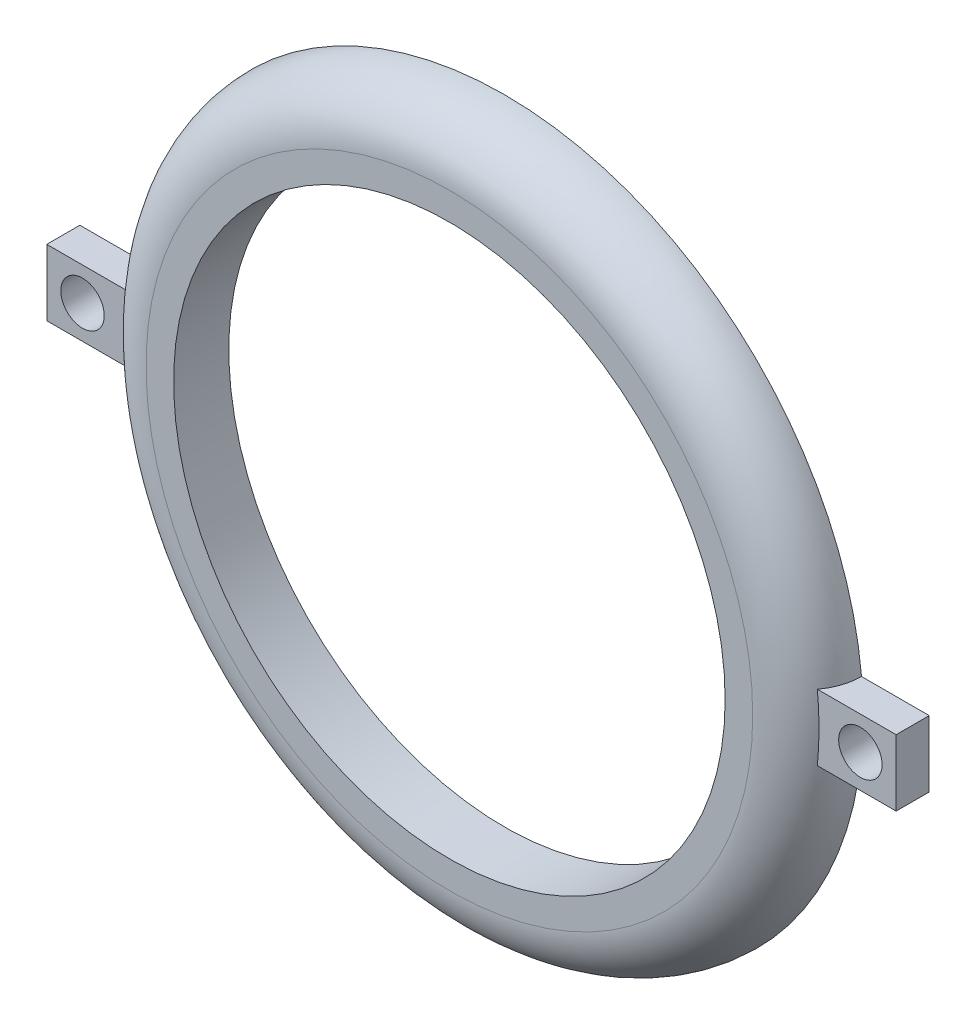
ISO-10303-21;
HEADER;
FILE_DESCRIPTION(('STEP AP214'),'2;1');
FILE_NAME('part.step','',(''),(''),'','','');
FILE_SCHEMA(('AUTOMOTIVE_DESIGN { 1 0 10303 214 1 1 1 1 }'));
ENDSEC;
DATA;
#1=APPLICATION_CONTEXT('core data for automotive mechanical design processes');
#2=APPLICATION_PROTOCOL_DEFINITION('international standard','automotive_design',2000,#1);
#3=PRODUCT_CONTEXT('',#1,'mechanical');
#4=PRODUCT('Part','Part','',(#3));
#5=PRODUCT_RELATED_PRODUCT_CATEGORY('part','',(#4));
#6=PRODUCT_DEFINITION_FORMATION('','',#4);
#7=PRODUCT_DEFINITION_CONTEXT('part definition',#1,'design');
#8=PRODUCT_DEFINITION('design','',#6,#7);
#9=PRODUCT_DEFINITION_SHAPE('','',#8);
#10=(LENGTH_UNIT() NAMED_UNIT(*) SI_UNIT(.MILLI.,.METRE.));
#11=(NAMED_UNIT(*) PLANE_ANGLE_UNIT() SI_UNIT($,.RADIAN.));
#12=(NAMED_UNIT(*) SI_UNIT($,.STERADIAN.) SOLID_ANGLE_UNIT());
#13=UNCERTAINTY_MEASURE_WITH_UNIT(LENGTH_MEASURE(1.E-05),#10,'distance_accuracy_value','');
#14=(GEOMETRIC_REPRESENTATION_CONTEXT(3) GLOBAL_UNCERTAINTY_ASSIGNED_CONTEXT((#13)) GLOBAL_UNIT_ASSIGNED_CONTEXT((#10,
#11,#12)) REPRESENTATION_CONTEXT('',''));
#15=CARTESIAN_POINT('',(0.,0.,0.));
#16=DIRECTION('',(0.,0.,1.));
#17=DIRECTION('',(1.,0.,0.));
#18=AXIS2_PLACEMENT_3D('',#15,#16,#17);
#19=CARTESIAN_POINT('',(0.,0.,2.54));
#20=DIRECTION('',(0.,0.,1.));
#21=DIRECTION('',(1.,0.,0.));
#22=AXIS2_PLACEMENT_3D('',#19,#20,#21);
#23=PLANE('',#22);
#24=CARTESIAN_POINT('',(0.,0.,2.54));
#25=DIRECTION('',(0.,0.,1.));
#26=DIRECTION('',(1.,0.,0.));
#27=AXIS2_PLACEMENT_3D('',#24,#25,#26);
#28=CIRCLE('',#27,13.97);
#29=CARTESIAN_POINT('',(13.97,0.,2.54));
#30=VERTEX_POINT('',#29);
#31=EDGE_CURVE('E121',#30,#30,#28,.T.);
#32=ORIENTED_EDGE('',*,*,#31,.T.);
#33=EDGE_LOOP('',(#32));
#34=FACE_BOUND('',#33,.T.);
#35=CARTESIAN_POINT('',(0.,0.,2.54));
#36=DIRECTION('',(0.,0.,1.));
#37=DIRECTION('',(1.,0.,0.));
#38=AXIS2_PLACEMENT_3D('',#35,#36,#37);
#39=CIRCLE('',#38,12.7);
#40=CARTESIAN_POINT('',(12.7,0.,2.54));
#41=VERTEX_POINT('',#40);
#42=EDGE_CURVE('E134',#41,#41,#39,.T.);
#43=ORIENTED_EDGE('',*,*,#42,.F.);
#44=EDGE_LOOP('',(#43));
#45=FACE_BOUND('',#44,.T.);
#46=ADVANCED_FACE('F39',(#34,#45),#23,.T.);
#47=CARTESIAN_POINT('',(0.,0.,0.));
#48=DIRECTION('',(0.,0.,1.));
#49=DIRECTION('',(1.,0.,0.));
#50=AXIS2_PLACEMENT_3D('',#47,#48,#49);
#51=PLANE('',#50);
#52=CARTESIAN_POINT('',(17.9112555409049,0.,0.));
#53=DIRECTION('',(0.,0.,1.));
#54=DIRECTION('',(1.,0.,0.));
#55=AXIS2_PLACEMENT_3D('',#52,#53,#54);
#56=CIRCLE('',#55,1.);
#57=CARTESIAN_POINT('',(18.9112555409049,0.,0.));
#58=VERTEX_POINT('',#57);
#59=EDGE_CURVE('E224',#58,#58,#56,.F.);
#60=ORIENTED_EDGE('',*,*,#59,.F.);
#61=EDGE_LOOP('',(#60));
#62=FACE_BOUND('',#61,.T.);
#63=CARTESIAN_POINT('',(-17.9112555409049,0.,0.));
#64=DIRECTION('',(0.,0.,1.));
#65=DIRECTION('',(1.,0.,0.));
#66=AXIS2_PLACEMENT_3D('',#63,#64,#65);
#67=CIRCLE('',#66,1.);
#68=CARTESIAN_POINT('',(-16.9112555409049,0.,0.));
#69=VERTEX_POINT('',#68);
#70=EDGE_CURVE('E227',#69,#69,#67,.T.);
#71=ORIENTED_EDGE('',*,*,#70,.T.);
#72=EDGE_LOOP('',(#71));
#73=FACE_BOUND('',#72,.T.);
#74=CARTESIAN_POINT('',(0.,0.,0.));
#75=DIRECTION('',(0.,0.,1.));
#76=DIRECTION('',(1.,0.,0.));
#77=AXIS2_PLACEMENT_3D('',#74,#75,#76);
#78=CIRCLE('',#77,16.51);
#79=CARTESIAN_POINT('',(-16.439511063289,-1.524,0.));
#80=VERTEX_POINT('',#79);
#81=CARTESIAN_POINT('',(16.439511063289,-1.524,0.));
#82=VERTEX_POINT('',#81);
#83=EDGE_CURVE('E133',#80,#82,#78,.T.);
#84=ORIENTED_EDGE('',*,*,#83,.F.);
#85=DIRECTION('',(1.,0.,0.));
#86=VECTOR('',#85,1.);
#87=CARTESIAN_POINT('',(-19.558,-1.524,0.));
#88=LINE('',#87,#86);
#89=CARTESIAN_POINT('',(-19.558,-1.524,0.));
#90=VERTEX_POINT('',#89);
#91=EDGE_CURVE('E158',#90,#80,#88,.T.);
#92=ORIENTED_EDGE('',*,*,#91,.F.);
#93=DIRECTION('',(0.,-1.,0.));
#94=VECTOR('',#93,1.);
#95=CARTESIAN_POINT('',(-19.558,-1.524,0.));
#96=LINE('',#95,#94);
#97=CARTESIAN_POINT('',(-19.558,1.524,0.));
#98=VERTEX_POINT('',#97);
#99=EDGE_CURVE('E156',#98,#90,#96,.T.);
#100=ORIENTED_EDGE('',*,*,#99,.F.);
#101=DIRECTION('',(1.,0.,0.));
#102=VECTOR('',#101,1.);
#103=CARTESIAN_POINT('',(-19.558,1.524,0.));
#104=LINE('',#103,#102);
#105=CARTESIAN_POINT('',(-16.439511063289,1.524,0.));
#106=VERTEX_POINT('',#105);
#107=EDGE_CURVE('E132',#98,#106,#104,.T.);
#108=ORIENTED_EDGE('',*,*,#107,.T.);
#109=CARTESIAN_POINT('',(16.439511063289,1.524,0.));
#110=VERTEX_POINT('',#109);
#111=EDGE_CURVE('E115',#110,#106,#78,.T.);
#112=ORIENTED_EDGE('',*,*,#111,.F.);
#113=DIRECTION('',(-1.,0.,0.));
#114=VECTOR('',#113,1.);
#115=CARTESIAN_POINT('',(19.558,1.524,0.));
#116=LINE('',#115,#114);
#117=CARTESIAN_POINT('',(19.558,1.524,0.));
#118=VERTEX_POINT('',#117);
#119=EDGE_CURVE('E128',#118,#110,#116,.T.);
#120=ORIENTED_EDGE('',*,*,#119,.F.);
#121=DIRECTION('',(0.,-1.,0.));
#122=VECTOR('',#121,1.);
#123=CARTESIAN_POINT('',(19.558,-1.524,0.));
#124=LINE('',#123,#122);
#125=CARTESIAN_POINT('',(19.558,-1.524,0.));
#126=VERTEX_POINT('',#125);
#127=EDGE_CURVE('E233',#118,#126,#124,.T.);
#128=ORIENTED_EDGE('',*,*,#127,.T.);
#129=DIRECTION('',(-1.,0.,0.));
#130=VECTOR('',#129,1.);
#131=CARTESIAN_POINT('',(19.558,-1.524,0.));
#132=LINE('',#131,#130);
#133=EDGE_CURVE('E140',#126,#82,#132,.T.);
#134=ORIENTED_EDGE('',*,*,#133,.T.);
#135=EDGE_LOOP('',(#84,#92,#100,#108,#112,#120,#128,#134));
#136=FACE_BOUND('',#135,.T.);
#137=CARTESIAN_POINT('',(0.,0.,0.));
#138=DIRECTION('',(0.,0.,1.));
#139=DIRECTION('',(1.,0.,0.));
#140=AXIS2_PLACEMENT_3D('',#137,#138,#139);
#141=CIRCLE('',#140,12.7);
#142=CARTESIAN_POINT('',(12.7,0.,0.));
#143=VERTEX_POINT('',#142);
#144=EDGE_CURVE('E164',#143,#143,#141,.T.);
#145=ORIENTED_EDGE('',*,*,#144,.T.);
#146=EDGE_LOOP('',(#145));
#147=FACE_BOUND('',#146,.T.);
#148=ADVANCED_FACE('F125',(#62,#73,#136,#147),#51,.F.);
#149=CARTESIAN_POINT('',(0.,0.,2.54));
#150=DIRECTION('',(0.,0.,-1.));
#151=DIRECTION('',(-1.,0.,0.));
#152=AXIS2_PLACEMENT_3D('',#149,#150,#151);
#153=CYLINDRICAL_SURFACE('',#152,12.7);
#154=ORIENTED_EDGE('',*,*,#42,.T.);
#155=EDGE_LOOP('',(#154));
#156=FACE_BOUND('',#155,.T.);
#157=ORIENTED_EDGE('',*,*,#144,.F.);
#158=EDGE_LOOP('',(#157));
#159=FACE_BOUND('',#158,.T.);
#160=ADVANCED_FACE('F208',(#156,#159),#153,.F.);
#161=CARTESIAN_POINT('',(-19.558,-1.524,1.524));
#162=DIRECTION('',(0.,1.,0.));
#163=DIRECTION('',(0.,0.,1.));
#164=AXIS2_PLACEMENT_3D('',#161,#162,#163);
#165=PLANE('',#164);
#166=ORIENTED_EDGE('',*,*,#91,.T.);
#167=CARTESIAN_POINT('',(-16.439511063289,-1.524,0.));
#168=CARTESIAN_POINT('',(-16.4395115458115,-1.524,0.0721522350961698));
#169=CARTESIAN_POINT('',(-16.4364218112615,-1.524,0.144270882993022));
#170=CARTESIAN_POINT('',(-16.4240980366451,-1.524,0.287979852270043));
#171=CARTESIAN_POINT('',(-16.4148641130353,-1.524,0.359570183637888));
#172=CARTESIAN_POINT('',(-16.3786715157551,-1.524,0.568976225995622));
#173=CARTESIAN_POINT('',(-16.3432089815179,-1.524,0.705418232561108));
#174=CARTESIAN_POINT('',(-16.2540867773291,-1.524,0.959352880674868));
#175=CARTESIAN_POINT('',(-16.2022047905555,-1.524,1.07747471471662));
#176=CARTESIAN_POINT('',(-16.1107072770769,-1.524,1.24908806240854));
#177=CARTESIAN_POINT('',(-16.0774306305755,-1.524,1.30602936303277));
#178=CARTESIAN_POINT('',(-16.0065461757478,-1.524,1.41715724868876));
#179=CARTESIAN_POINT('',(-15.9689379295579,-1.524,1.47134355442996));
#180=CARTESIAN_POINT('',(-15.9292632597996,-1.524,1.5239999999999));
#181=B_SPLINE_CURVE_WITH_KNOTS('',3,(#167,#168,#169,#170,#171,#172,#173,#174,#175,#176,#177,
#178,#179,#180),.UNSPECIFIED.,.F.,.F.,(4,2,2,2,2,2,4),(0.,0.216323955064832,0.432643810054661,
0.853463347231353,1.23895320611262,1.4366304732274,1.63432774029175),.UNSPECIFIED.);
#182=CARTESIAN_POINT('',(-15.9292632597999,-1.524,1.524));
#183=VERTEX_POINT('',#182);
#184=EDGE_CURVE('E196',#80,#183,#181,.T.);
#185=ORIENTED_EDGE('',*,*,#184,.T.);
#186=DIRECTION('',(1.,0.,0.));
#187=VECTOR('',#186,1.);
#188=CARTESIAN_POINT('',(-19.558,-1.524,1.524));
#189=LINE('',#188,#187);
#190=CARTESIAN_POINT('',(-19.558,-1.524,1.524));
#191=VERTEX_POINT('',#190);
#192=EDGE_CURVE('E66',#191,#183,#189,.T.);
#193=ORIENTED_EDGE('',*,*,#192,.F.);
#194=DIRECTION('',(0.,0.,1.));
#195=VECTOR('',#194,1.);
#196=CARTESIAN_POINT('',(-19.558,-1.524,1.524));
#197=LINE('',#196,#195);
#198=EDGE_CURVE('E144',#90,#191,#197,.T.);
#199=ORIENTED_EDGE('',*,*,#198,.F.);
#200=EDGE_LOOP('',(#166,#185,#193,#199));
#201=FACE_BOUND('',#200,.T.);
#202=ADVANCED_FACE('F202',(#201),#165,.F.);
#203=CARTESIAN_POINT('',(-19.558,1.524,1.524));
#204=DIRECTION('',(0.,0.,-1.));
#205=DIRECTION('',(0.,1.,0.));
#206=AXIS2_PLACEMENT_3D('',#203,#204,#205);
#207=PLANE('',#206);
#208=CARTESIAN_POINT('',(-17.9112555409049,0.,1.524));
#209=DIRECTION('',(0.,0.,1.));
#210=DIRECTION('',(1.,0.,0.));
#211=AXIS2_PLACEMENT_3D('',#208,#209,#210);
#212=CIRCLE('',#211,1.);
#213=CARTESIAN_POINT('',(-16.9112555409049,0.,1.524));
#214=VERTEX_POINT('',#213);
#215=EDGE_CURVE('E230',#214,#214,#212,.T.);
#216=ORIENTED_EDGE('',*,*,#215,.F.);
#217=EDGE_LOOP('',(#216));
#218=FACE_BOUND('',#217,.T.);
#219=ORIENTED_EDGE('',*,*,#192,.T.);
#220=CARTESIAN_POINT('',(0.,0.,1.524));
#221=DIRECTION('',(0.,0.,1.));
#222=DIRECTION('',(1.,0.,0.));
#223=AXIS2_PLACEMENT_3D('',#220,#221,#222);
#224=CIRCLE('',#223,16.0020000000004);
#225=CARTESIAN_POINT('',(-15.9292632597999,1.524,1.524));
#226=VERTEX_POINT('',#225);
#227=EDGE_CURVE('E53',#183,#226,#224,.F.);
#228=ORIENTED_EDGE('',*,*,#227,.T.);
#229=DIRECTION('',(1.,0.,0.));
#230=VECTOR('',#229,1.);
#231=CARTESIAN_POINT('',(-19.558,1.524,1.524));
#232=LINE('',#231,#230);
#233=CARTESIAN_POINT('',(-19.558,1.524,1.524));
#234=VERTEX_POINT('',#233);
#235=EDGE_CURVE('E59',#234,#226,#232,.T.);
#236=ORIENTED_EDGE('',*,*,#235,.F.);
#237=DIRECTION('',(0.,1.,0.));
#238=VECTOR('',#237,1.);
#239=CARTESIAN_POINT('',(-19.558,1.524,1.524));
#240=LINE('',#239,#238);
#241=EDGE_CURVE('E152',#191,#234,#240,.T.);
#242=ORIENTED_EDGE('',*,*,#241,.F.);
#243=EDGE_LOOP('',(#219,#228,#236,#242));
#244=FACE_BOUND('',#243,.T.);
#245=ADVANCED_FACE('F207',(#218,#244),#207,.F.);
#246=CARTESIAN_POINT('',(-19.558,1.524,0.));
#247=DIRECTION('',(0.,-1.,0.));
#248=DIRECTION('',(0.,0.,-1.));
#249=AXIS2_PLACEMENT_3D('',#246,#247,#248);
#250=PLANE('',#249);
#251=ORIENTED_EDGE('',*,*,#235,.T.);
#252=CARTESIAN_POINT('',(-15.9292632597999,1.524,1.524));
#253=CARTESIAN_POINT('',(-15.9727161687421,1.524,1.46632680294502));
#254=CARTESIAN_POINT('',(-16.0136876396078,1.524,1.4068254589423));
#255=CARTESIAN_POINT('',(-16.0904149546255,1.524,1.28454983076119));
#256=CARTESIAN_POINT('',(-16.1261707782533,1.524,1.22177553370465));
#257=CARTESIAN_POINT('',(-16.2234287346116,1.524,1.03263202721366));
#258=CARTESIAN_POINT('',(-16.2773179295235,1.524,0.902240902667115));
#259=CARTESIAN_POINT('',(-16.3590496760604,1.524,0.645832803557955));
#260=CARTESIAN_POINT('',(-16.3887252221132,1.524,0.52039497755847));
#261=CARTESIAN_POINT('',(-16.4189594586133,1.524,0.328453399247424));
#262=CARTESIAN_POINT('',(-16.4266599829289,1.524,0.263012438074771));
#263=CARTESIAN_POINT('',(-16.4369369123377,1.524,0.13172166999262));
#264=CARTESIAN_POINT('',(-16.439512715203,1.524,0.065871815944357));
#265=CARTESIAN_POINT('',(-16.439511063289,1.524,0.));
#266=B_SPLINE_CURVE_WITH_KNOTS('',3,(#252,#253,#254,#255,#256,#257,#258,#259,#260,#261,#262,
#263,#264,#265),.UNSPECIFIED.,.F.,.F.,(4,2,2,2,2,2,4),(0.,0.216499738273205,0.433000328476758,
0.85415790573492,1.23930776337478,1.43680611290498,1.63432766993882),.UNSPECIFIED.);
#267=EDGE_CURVE('E11',#226,#106,#266,.T.);
#268=ORIENTED_EDGE('',*,*,#267,.T.);
#269=ORIENTED_EDGE('',*,*,#107,.F.);
#270=DIRECTION('',(0.,0.,-1.));
#271=VECTOR('',#270,1.);
#272=CARTESIAN_POINT('',(-19.558,1.524,0.));
#273=LINE('',#272,#271);
#274=EDGE_CURVE('E154',#234,#98,#273,.T.);
#275=ORIENTED_EDGE('',*,*,#274,.F.);
#276=EDGE_LOOP('',(#251,#268,#269,#275));
#277=FACE_BOUND('',#276,.T.);
#278=ADVANCED_FACE('F251',(#277),#250,.F.);
#279=CARTESIAN_POINT('',(-19.558,0.,0.));
#280=DIRECTION('',(1.,0.,0.));
#281=DIRECTION('',(0.,0.,-1.));
#282=AXIS2_PLACEMENT_3D('',#279,#280,#281);
#283=PLANE('',#282);
#284=ORIENTED_EDGE('',*,*,#198,.T.);
#285=ORIENTED_EDGE('',*,*,#241,.T.);
#286=ORIENTED_EDGE('',*,*,#274,.T.);
#287=ORIENTED_EDGE('',*,*,#99,.T.);
#288=EDGE_LOOP('',(#284,#285,#286,#287));
#289=FACE_BOUND('',#288,.T.);
#290=ADVANCED_FACE('F188',(#289),#283,.F.);
#291=CARTESIAN_POINT('',(19.558,-1.524,1.524));
#292=DIRECTION('',(0.,-1.,0.));
#293=DIRECTION('',(0.,0.,-1.));
#294=AXIS2_PLACEMENT_3D('',#291,#292,#293);
#295=PLANE('',#294);
#296=DIRECTION('',(-1.,0.,0.));
#297=VECTOR('',#296,1.);
#298=CARTESIAN_POINT('',(19.558,-1.524,1.524));
#299=LINE('',#298,#297);
#300=CARTESIAN_POINT('',(19.558,-1.524,1.524));
#301=VERTEX_POINT('',#300);
#302=CARTESIAN_POINT('',(15.9292632597999,-1.524,1.524));
#303=VERTEX_POINT('',#302);
#304=EDGE_CURVE('E146',#301,#303,#299,.T.);
#305=ORIENTED_EDGE('',*,*,#304,.T.);
#306=CARTESIAN_POINT('',(15.9292632597999,-1.524,1.524));
#307=CARTESIAN_POINT('',(15.9727161687421,-1.524,1.46632680294502));
#308=CARTESIAN_POINT('',(16.0136876396078,-1.524,1.4068254589423));
#309=CARTESIAN_POINT('',(16.0904149546255,-1.524,1.28454983076119));
#310=CARTESIAN_POINT('',(16.1261707782533,-1.524,1.22177553370465));
#311=CARTESIAN_POINT('',(16.2234287346116,-1.524,1.03263202721366));
#312=CARTESIAN_POINT('',(16.2773179295235,-1.524,0.902240902667115));
#313=CARTESIAN_POINT('',(16.3590496760604,-1.524,0.645832803557955));
#314=CARTESIAN_POINT('',(16.3887252221132,-1.524,0.52039497755847));
#315=CARTESIAN_POINT('',(16.4189594586133,-1.524,0.328453399247423));
#316=CARTESIAN_POINT('',(16.4266599829289,-1.524,0.263012438074771));
#317=CARTESIAN_POINT('',(16.4369369123377,-1.524,0.13172166999262));
#318=CARTESIAN_POINT('',(16.439512715203,-1.524,0.065871815944357));
#319=CARTESIAN_POINT('',(16.439511063289,-1.524,0.));
#320=B_SPLINE_CURVE_WITH_KNOTS('',3,(#306,#307,#308,#309,#310,#311,#312,#313,#314,#315,#316,
#317,#318,#319),.UNSPECIFIED.,.F.,.F.,(4,2,2,2,2,2,4),(0.,0.216499738273205,0.433000328476758,
0.85415790573492,1.23930776337478,1.43680611290498,1.63432766993882),.UNSPECIFIED.);
#321=EDGE_CURVE('E190',#303,#82,#320,.T.);
#322=ORIENTED_EDGE('',*,*,#321,.T.);
#323=ORIENTED_EDGE('',*,*,#133,.F.);
#324=DIRECTION('',(0.,0.,1.));
#325=VECTOR('',#324,1.);
#326=CARTESIAN_POINT('',(19.558,-1.524,1.524));
#327=LINE('',#326,#325);
#328=EDGE_CURVE('E229',#126,#301,#327,.T.);
#329=ORIENTED_EDGE('',*,*,#328,.T.);
#330=EDGE_LOOP('',(#305,#322,#323,#329));
#331=FACE_BOUND('',#330,.T.);
#332=ADVANCED_FACE('F183',(#331),#295,.T.);
#333=CARTESIAN_POINT('',(19.558,1.524,0.));
#334=DIRECTION('',(0.,1.,0.));
#335=DIRECTION('',(0.,0.,1.));
#336=AXIS2_PLACEMENT_3D('',#333,#334,#335);
#337=PLANE('',#336);
#338=ORIENTED_EDGE('',*,*,#119,.T.);
#339=CARTESIAN_POINT('',(16.439511063289,1.524,0.));
#340=CARTESIAN_POINT('',(16.4395115458115,1.524,0.0721522350961698));
#341=CARTESIAN_POINT('',(16.4364218112615,1.524,0.144270882993022));
#342=CARTESIAN_POINT('',(16.4240980366451,1.524,0.287979852270043));
#343=CARTESIAN_POINT('',(16.4148641130353,1.524,0.359570183637888));
#344=CARTESIAN_POINT('',(16.3786715157551,1.524,0.568976225995622));
#345=CARTESIAN_POINT('',(16.3432089815179,1.524,0.705418232561109));
#346=CARTESIAN_POINT('',(16.2540867773291,1.524,0.959352880674867));
#347=CARTESIAN_POINT('',(16.2022047905555,1.524,1.07747471471662));
#348=CARTESIAN_POINT('',(16.1107072770769,1.524,1.24908806240854));
#349=CARTESIAN_POINT('',(16.0774306305755,1.524,1.30602936303277));
#350=CARTESIAN_POINT('',(16.0065461757478,1.524,1.41715724868876));
#351=CARTESIAN_POINT('',(15.9689379295579,1.524,1.47134355442996));
#352=CARTESIAN_POINT('',(15.9292632597996,1.524,1.5239999999999));
#353=B_SPLINE_CURVE_WITH_KNOTS('',3,(#339,#340,#341,#342,#343,#344,#345,#346,#347,#348,#349,
#350,#351,#352),.UNSPECIFIED.,.F.,.F.,(4,2,2,2,2,2,4),(0.,0.216323955064832,0.432643810054661,
0.853463347231353,1.23895320611262,1.4366304732274,1.63432774029175),.UNSPECIFIED.);
#354=CARTESIAN_POINT('',(15.9292632597999,1.524,1.524));
#355=VERTEX_POINT('',#354);
#356=EDGE_CURVE('E111',#110,#355,#353,.T.);
#357=ORIENTED_EDGE('',*,*,#356,.T.);
#358=DIRECTION('',(-1.,0.,0.));
#359=VECTOR('',#358,1.);
#360=CARTESIAN_POINT('',(19.558,1.524,1.524));
#361=LINE('',#360,#359);
#362=CARTESIAN_POINT('',(19.558,1.524,1.524));
#363=VERTEX_POINT('',#362);
#364=EDGE_CURVE('E141',#363,#355,#361,.T.);
#365=ORIENTED_EDGE('',*,*,#364,.F.);
#366=DIRECTION('',(0.,0.,-1.));
#367=VECTOR('',#366,1.);
#368=CARTESIAN_POINT('',(19.558,1.524,0.));
#369=LINE('',#368,#367);
#370=EDGE_CURVE('E139',#363,#118,#369,.T.);
#371=ORIENTED_EDGE('',*,*,#370,.T.);
#372=EDGE_LOOP('',(#338,#357,#365,#371));
#373=FACE_BOUND('',#372,.T.);
#374=ADVANCED_FACE('F137',(#373),#337,.T.);
#375=CARTESIAN_POINT('',(19.558,1.524,1.524));
#376=DIRECTION('',(0.,0.,1.));
#377=DIRECTION('',(0.,-1.,0.));
#378=AXIS2_PLACEMENT_3D('',#375,#376,#377);
#379=PLANE('',#378);
#380=CARTESIAN_POINT('',(17.9112555409049,0.,1.524));
#381=DIRECTION('',(0.,0.,-1.));
#382=DIRECTION('',(-1.,0.,0.));
#383=AXIS2_PLACEMENT_3D('',#380,#381,#382);
#384=CIRCLE('',#383,1.);
#385=CARTESIAN_POINT('',(16.9112555409049,0.,1.524));
#386=VERTEX_POINT('',#385);
#387=EDGE_CURVE('E279',#386,#386,#384,.T.);
#388=ORIENTED_EDGE('',*,*,#387,.T.);
#389=EDGE_LOOP('',(#388));
#390=FACE_BOUND('',#389,.T.);
#391=ORIENTED_EDGE('',*,*,#364,.T.);
#392=CARTESIAN_POINT('',(0.,0.,1.524));
#393=DIRECTION('',(0.,0.,1.));
#394=DIRECTION('',(1.,0.,0.));
#395=AXIS2_PLACEMENT_3D('',#392,#393,#394);
#396=CIRCLE('',#395,16.0020000000004);
#397=EDGE_CURVE('E118',#355,#303,#396,.F.);
#398=ORIENTED_EDGE('',*,*,#397,.T.);
#399=ORIENTED_EDGE('',*,*,#304,.F.);
#400=DIRECTION('',(0.,1.,0.));
#401=VECTOR('',#400,1.);
#402=CARTESIAN_POINT('',(19.558,1.524,1.524));
#403=LINE('',#402,#401);
#404=EDGE_CURVE('E241',#301,#363,#403,.T.);
#405=ORIENTED_EDGE('',*,*,#404,.T.);
#406=EDGE_LOOP('',(#391,#398,#399,#405));
#407=FACE_BOUND('',#406,.T.);
#408=ADVANCED_FACE('F182',(#390,#407),#379,.T.);
#409=CARTESIAN_POINT('',(19.558,0.,0.));
#410=DIRECTION('',(-1.,0.,0.));
#411=DIRECTION('',(0.,0.,-1.));
#412=AXIS2_PLACEMENT_3D('',#409,#410,#411);
#413=PLANE('',#412);
#414=ORIENTED_EDGE('',*,*,#328,.F.);
#415=ORIENTED_EDGE('',*,*,#127,.F.);
#416=ORIENTED_EDGE('',*,*,#370,.F.);
#417=ORIENTED_EDGE('',*,*,#404,.F.);
#418=EDGE_LOOP('',(#414,#415,#416,#417));
#419=FACE_BOUND('',#418,.T.);
#420=ADVANCED_FACE('F268',(#419),#413,.F.);
#421=CARTESIAN_POINT('',(0.,0.,0.));
#422=DIRECTION('',(0.,0.,1.));
#423=DIRECTION('',(1.,0.,0.));
#424=AXIS2_PLACEMENT_3D('',#421,#422,#423);
#425=TOROIDAL_SURFACE('',#424,13.97,2.54);
#426=ORIENTED_EDGE('',*,*,#356,.F.);
#427=ORIENTED_EDGE('',*,*,#111,.T.);
#428=ORIENTED_EDGE('',*,*,#267,.F.);
#429=ORIENTED_EDGE('',*,*,#227,.F.);
#430=ORIENTED_EDGE('',*,*,#184,.F.);
#431=ORIENTED_EDGE('',*,*,#83,.T.);
#432=ORIENTED_EDGE('',*,*,#321,.F.);
#433=ORIENTED_EDGE('',*,*,#397,.F.);
#434=EDGE_LOOP('',(#426,#427,#428,#429,#430,#431,#432,#433));
#435=FACE_BOUND('',#434,.T.);
#436=ORIENTED_EDGE('',*,*,#31,.F.);
#437=EDGE_LOOP('',(#436));
#438=FACE_BOUND('',#437,.T.);
#439=ADVANCED_FACE('F41',(#435,#438),#425,.T.);
#440=CARTESIAN_POINT('',(-17.9112555409049,0.,-1.016));
#441=DIRECTION('',(0.,0.,1.));
#442=DIRECTION('',(1.,0.,0.));
#443=AXIS2_PLACEMENT_3D('',#440,#441,#442);
#444=CYLINDRICAL_SURFACE('',#443,1.);
#445=ORIENTED_EDGE('',*,*,#215,.T.);
#446=EDGE_LOOP('',(#445));
#447=FACE_BOUND('',#446,.T.);
#448=ORIENTED_EDGE('',*,*,#70,.F.);
#449=EDGE_LOOP('',(#448));
#450=FACE_BOUND('',#449,.T.);
#451=ADVANCED_FACE('F260',(#447,#450),#444,.F.);
#452=CARTESIAN_POINT('',(17.9112555409049,0.,-1.016));
#453=DIRECTION('',(0.,0.,1.));
#454=DIRECTION('',(1.,0.,0.));
#455=AXIS2_PLACEMENT_3D('',#452,#453,#454);
#456=CYLINDRICAL_SURFACE('',#455,1.);
#457=ORIENTED_EDGE('',*,*,#387,.F.);
#458=EDGE_LOOP('',(#457));
#459=FACE_BOUND('',#458,.T.);
#460=ORIENTED_EDGE('',*,*,#59,.T.);
#461=EDGE_LOOP('',(#460));
#462=FACE_BOUND('',#461,.T.);
#463=ADVANCED_FACE('F261',(#459,#462),#456,.F.);
#464=CLOSED_SHELL('',(#46,#148,#160,#202,#245,#278,#290,#332,#374,#408,#420,#439,#451,#463));
#465=MANIFOLD_SOLID_BREP('B2',#464);
#466=ADVANCED_BREP_SHAPE_REPRESENTATION('',(#18,#465),#14);
#467=SHAPE_DEFINITION_REPRESENTATION(#9,#466);
ENDSEC;
END-ISO-10303-21;
